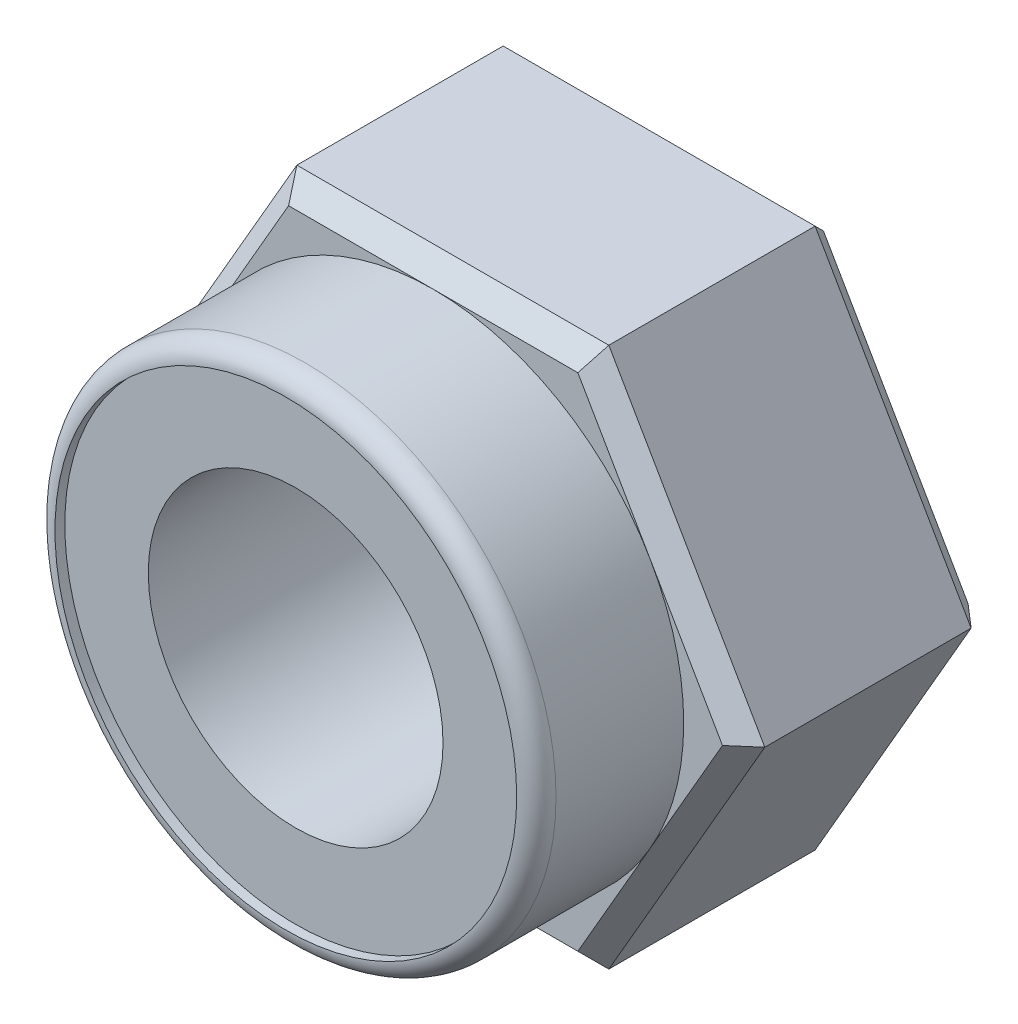
ISO-10303-21;
HEADER;
FILE_DESCRIPTION(('STEP AP214'),'2;1');
FILE_NAME('part.step','',(''),(''),'','','');
FILE_SCHEMA(('AUTOMOTIVE_DESIGN { 1 0 10303 214 1 1 1 1 }'));
ENDSEC;
DATA;
#1=APPLICATION_CONTEXT('core data for automotive mechanical design processes');
#2=APPLICATION_PROTOCOL_DEFINITION('international standard','automotive_design',2000,#1);
#3=PRODUCT_CONTEXT('',#1,'mechanical');
#4=PRODUCT('Part','Part','',(#3));
#5=PRODUCT_RELATED_PRODUCT_CATEGORY('part','',(#4));
#6=PRODUCT_DEFINITION_FORMATION('','',#4);
#7=PRODUCT_DEFINITION_CONTEXT('part definition',#1,'design');
#8=PRODUCT_DEFINITION('design','',#6,#7);
#9=PRODUCT_DEFINITION_SHAPE('','',#8);
#10=(LENGTH_UNIT() NAMED_UNIT(*) SI_UNIT(.MILLI.,.METRE.));
#11=(NAMED_UNIT(*) PLANE_ANGLE_UNIT() SI_UNIT($,.RADIAN.));
#12=(NAMED_UNIT(*) SI_UNIT($,.STERADIAN.) SOLID_ANGLE_UNIT());
#13=UNCERTAINTY_MEASURE_WITH_UNIT(LENGTH_MEASURE(1.E-05),#10,'distance_accuracy_value','');
#14=(GEOMETRIC_REPRESENTATION_CONTEXT(3) GLOBAL_UNCERTAINTY_ASSIGNED_CONTEXT((#13)) GLOBAL_UNIT_ASSIGNED_CONTEXT((#10,
#11,#12)) REPRESENTATION_CONTEXT('',''));
#15=CARTESIAN_POINT('',(0.,0.,0.));
#16=DIRECTION('',(0.,0.,1.));
#17=DIRECTION('',(1.,0.,0.));
#18=AXIS2_PLACEMENT_3D('',#15,#16,#17);
#19=CARTESIAN_POINT('',(0.,0.,2.5));
#20=DIRECTION('',(0.,0.,-1.));
#21=DIRECTION('',(-1.,0.,0.));
#22=AXIS2_PLACEMENT_3D('',#19,#20,#21);
#23=CYLINDRICAL_SURFACE('',#22,1.5);
#24=CARTESIAN_POINT('',(0.,0.,0.));
#25=DIRECTION('',(0.,0.,1.));
#26=DIRECTION('',(1.,0.,0.));
#27=AXIS2_PLACEMENT_3D('',#24,#25,#26);
#28=CIRCLE('',#27,1.5);
#29=CARTESIAN_POINT('',(1.5,0.,0.));
#30=VERTEX_POINT('',#29);
#31=EDGE_CURVE('E178',#30,#30,#28,.T.);
#32=ORIENTED_EDGE('',*,*,#31,.F.);
#33=EDGE_LOOP('',(#32));
#34=FACE_BOUND('',#33,.T.);
#35=CARTESIAN_POINT('',(0.,0.,3.9));
#36=DIRECTION('',(0.,0.,1.));
#37=DIRECTION('',(1.,0.,0.));
#38=AXIS2_PLACEMENT_3D('',#35,#36,#37);
#39=CIRCLE('',#38,1.5);
#40=CARTESIAN_POINT('',(1.5,0.,3.9));
#41=VERTEX_POINT('',#40);
#42=EDGE_CURVE('E393',#41,#41,#39,.T.);
#43=ORIENTED_EDGE('',*,*,#42,.T.);
#44=EDGE_LOOP('',(#43));
#45=FACE_BOUND('',#44,.T.);
#46=ADVANCED_FACE('F36',(#34,#45),#23,.F.);
#47=CARTESIAN_POINT('',(0.,0.,2.5));
#48=DIRECTION('',(0.,0.,1.));
#49=DIRECTION('',(1.,0.,0.));
#50=AXIS2_PLACEMENT_3D('',#47,#48,#49);
#51=PLANE('',#50);
#52=CARTESIAN_POINT('',(0.,0.,2.5));
#53=DIRECTION('',(0.,0.,1.));
#54=DIRECTION('',(1.,0.,0.));
#55=AXIS2_PLACEMENT_3D('',#52,#53,#54);
#56=CIRCLE('',#55,2.55);
#57=CARTESIAN_POINT('',(2.20836477965032,1.275,2.5));
#58=VERTEX_POINT('',#57);
#59=CARTESIAN_POINT('',(0.,2.55,2.5));
#60=VERTEX_POINT('',#59);
#61=EDGE_CURVE('E166',#58,#60,#56,.T.);
#62=ORIENTED_EDGE('',*,*,#61,.F.);
#63=DIRECTION('',(-0.5,0.866025403784439,0.));
#64=VECTOR('',#63,1.);
#65=CARTESIAN_POINT('',(1.41450815951458,2.65,2.5));
#66=LINE('',#65,#64);
#67=CARTESIAN_POINT('',(1.47224318643354,2.55,2.5));
#68=VERTEX_POINT('',#67);
#69=EDGE_CURVE('E153',#58,#68,#66,.T.);
#70=ORIENTED_EDGE('',*,*,#69,.T.);
#71=DIRECTION('',(-1.,0.,0.));
#72=VECTOR('',#71,1.);
#73=CARTESIAN_POINT('',(-1.58771324027147,2.55,2.5));
#74=LINE('',#73,#72);
#75=EDGE_CURVE('E168',#68,#60,#74,.T.);
#76=ORIENTED_EDGE('',*,*,#75,.T.);
#77=EDGE_LOOP('',(#62,#70,#76));
#78=FACE_BOUND('',#77,.T.);
#79=ADVANCED_FACE('F167',(#78),#51,.T.);
#80=CARTESIAN_POINT('',(-2.20836477965032,1.275,2.5));
#81=VERTEX_POINT('',#80);
#82=EDGE_CURVE('E44',#60,#81,#56,.T.);
#83=ORIENTED_EDGE('',*,*,#82,.F.);
#84=CARTESIAN_POINT('',(-1.47224318643355,2.55,2.5));
#85=VERTEX_POINT('',#84);
#86=EDGE_CURVE('E239',#60,#85,#74,.T.);
#87=ORIENTED_EDGE('',*,*,#86,.T.);
#88=DIRECTION('',(-0.5,-0.866025403784439,0.));
#89=VECTOR('',#88,1.);
#90=CARTESIAN_POINT('',(-3.00222139978606,-0.1,2.5));
#91=LINE('',#90,#89);
#92=EDGE_CURVE('E242',#85,#81,#91,.T.);
#93=ORIENTED_EDGE('',*,*,#92,.T.);
#94=EDGE_LOOP('',(#83,#87,#93));
#95=FACE_BOUND('',#94,.T.);
#96=ADVANCED_FACE('F352',(#95),#51,.T.);
#97=CARTESIAN_POINT('',(-2.20836477965032,-1.275,2.5));
#98=VERTEX_POINT('',#97);
#99=EDGE_CURVE('E359',#81,#98,#56,.T.);
#100=ORIENTED_EDGE('',*,*,#99,.F.);
#101=CARTESIAN_POINT('',(-2.94448637286709,0.,2.5));
#102=VERTEX_POINT('',#101);
#103=EDGE_CURVE('E241',#81,#102,#91,.T.);
#104=ORIENTED_EDGE('',*,*,#103,.T.);
#105=DIRECTION('',(0.5,-0.866025403784439,0.));
#106=VECTOR('',#105,1.);
#107=CARTESIAN_POINT('',(-1.41450815951458,-2.65,2.5));
#108=LINE('',#107,#106);
#109=EDGE_CURVE('E246',#102,#98,#108,.T.);
#110=ORIENTED_EDGE('',*,*,#109,.T.);
#111=EDGE_LOOP('',(#100,#104,#110));
#112=FACE_BOUND('',#111,.T.);
#113=ADVANCED_FACE('F357',(#112),#51,.T.);
#114=CARTESIAN_POINT('',(0.,-2.55,2.5));
#115=VERTEX_POINT('',#114);
#116=EDGE_CURVE('E59',#98,#115,#56,.T.);
#117=ORIENTED_EDGE('',*,*,#116,.F.);
#118=CARTESIAN_POINT('',(-1.47224318643355,-2.55,2.5));
#119=VERTEX_POINT('',#118);
#120=EDGE_CURVE('E245',#98,#119,#108,.T.);
#121=ORIENTED_EDGE('',*,*,#120,.T.);
#122=DIRECTION('',(1.,0.,0.));
#123=VECTOR('',#122,1.);
#124=CARTESIAN_POINT('',(1.58771324027147,-2.55,2.5));
#125=LINE('',#124,#123);
#126=EDGE_CURVE('E250',#119,#115,#125,.T.);
#127=ORIENTED_EDGE('',*,*,#126,.T.);
#128=EDGE_LOOP('',(#117,#121,#127));
#129=FACE_BOUND('',#128,.T.);
#130=ADVANCED_FACE('F361',(#129),#51,.T.);
#131=CARTESIAN_POINT('',(2.20836477965032,-1.275,2.5));
#132=VERTEX_POINT('',#131);
#133=EDGE_CURVE('E51',#115,#132,#56,.T.);
#134=ORIENTED_EDGE('',*,*,#133,.F.);
#135=CARTESIAN_POINT('',(1.47224318643354,-2.55,2.5));
#136=VERTEX_POINT('',#135);
#137=EDGE_CURVE('E249',#115,#136,#125,.T.);
#138=ORIENTED_EDGE('',*,*,#137,.T.);
#139=DIRECTION('',(0.5,0.866025403784439,0.));
#140=VECTOR('',#139,1.);
#141=CARTESIAN_POINT('',(3.00222139978605,0.100000000000001,2.5));
#142=LINE('',#141,#140);
#143=EDGE_CURVE('E164',#136,#132,#142,.T.);
#144=ORIENTED_EDGE('',*,*,#143,.T.);
#145=EDGE_LOOP('',(#134,#138,#144));
#146=FACE_BOUND('',#145,.T.);
#147=ADVANCED_FACE('F367',(#146),#51,.T.);
#148=EDGE_CURVE('E148',#132,#58,#56,.T.);
#149=ORIENTED_EDGE('',*,*,#148,.F.);
#150=CARTESIAN_POINT('',(2.94448637286709,0.,2.5));
#151=VERTEX_POINT('',#150);
#152=EDGE_CURVE('E150',#132,#151,#142,.T.);
#153=ORIENTED_EDGE('',*,*,#152,.T.);
#154=EDGE_CURVE('E144',#151,#58,#66,.T.);
#155=ORIENTED_EDGE('',*,*,#154,.T.);
#156=EDGE_LOOP('',(#149,#153,#155));
#157=FACE_BOUND('',#156,.T.);
#158=ADVANCED_FACE('F146',(#157),#51,.T.);
#159=CARTESIAN_POINT('',(0.,0.,0.));
#160=DIRECTION('',(0.,0.,1.));
#161=DIRECTION('',(1.,0.,0.));
#162=AXIS2_PLACEMENT_3D('',#159,#160,#161);
#163=PLANE('',#162);
#164=DIRECTION('',(0.5,-0.866025403784439,0.));
#165=VECTOR('',#164,1.);
#166=CARTESIAN_POINT('',(2.20836477965032,1.275,0.));
#167=LINE('',#166,#165);
#168=CARTESIAN_POINT('',(1.47224318643354,2.55,0.));
#169=VERTEX_POINT('',#168);
#170=CARTESIAN_POINT('',(2.94448637286709,0.,0.));
#171=VERTEX_POINT('',#170);
#172=EDGE_CURVE('E205',#169,#171,#167,.T.);
#173=ORIENTED_EDGE('',*,*,#172,.T.);
#174=DIRECTION('',(-0.5,-0.866025403784439,0.));
#175=VECTOR('',#174,1.);
#176=CARTESIAN_POINT('',(2.20836477965032,-1.275,0.));
#177=LINE('',#176,#175);
#178=CARTESIAN_POINT('',(1.47224318643354,-2.55,0.));
#179=VERTEX_POINT('',#178);
#180=EDGE_CURVE('E215',#171,#179,#177,.T.);
#181=ORIENTED_EDGE('',*,*,#180,.T.);
#182=DIRECTION('',(-1.,0.,0.));
#183=VECTOR('',#182,1.);
#184=CARTESIAN_POINT('',(0.,-2.55,0.));
#185=LINE('',#184,#183);
#186=CARTESIAN_POINT('',(-1.47224318643354,-2.55,0.));
#187=VERTEX_POINT('',#186);
#188=EDGE_CURVE('E213',#179,#187,#185,.T.);
#189=ORIENTED_EDGE('',*,*,#188,.T.);
#190=DIRECTION('',(-0.5,0.866025403784439,0.));
#191=VECTOR('',#190,1.);
#192=CARTESIAN_POINT('',(-2.20836477965032,-1.275,0.));
#193=LINE('',#192,#191);
#194=CARTESIAN_POINT('',(-2.94448637286709,0.,0.));
#195=VERTEX_POINT('',#194);
#196=EDGE_CURVE('E211',#187,#195,#193,.T.);
#197=ORIENTED_EDGE('',*,*,#196,.T.);
#198=DIRECTION('',(0.5,0.866025403784439,0.));
#199=VECTOR('',#198,1.);
#200=CARTESIAN_POINT('',(-2.20836477965032,1.275,0.));
#201=LINE('',#200,#199);
#202=CARTESIAN_POINT('',(-1.47224318643354,2.55,0.));
#203=VERTEX_POINT('',#202);
#204=EDGE_CURVE('E209',#195,#203,#201,.T.);
#205=ORIENTED_EDGE('',*,*,#204,.T.);
#206=DIRECTION('',(1.,0.,0.));
#207=VECTOR('',#206,1.);
#208=CARTESIAN_POINT('',(0.,2.55,0.));
#209=LINE('',#208,#207);
#210=EDGE_CURVE('E207',#203,#169,#209,.T.);
#211=ORIENTED_EDGE('',*,*,#210,.T.);
#212=EDGE_LOOP('',(#173,#181,#189,#197,#205,#211));
#213=FACE_BOUND('',#212,.T.);
#214=ORIENTED_EDGE('',*,*,#31,.T.);
#215=EDGE_LOOP('',(#214));
#216=FACE_BOUND('',#215,.T.);
#217=ADVANCED_FACE('F314',(#213,#216),#163,.F.);
#218=CARTESIAN_POINT('',(-3.17542648054294,0.,2.5));
#219=DIRECTION('',(0.866025403784439,0.5,0.));
#220=DIRECTION('',(-0.5,0.866025403784439,0.));
#221=AXIS2_PLACEMENT_3D('',#218,#219,#220);
#222=PLANE('',#221);
#223=DIRECTION('',(0.,0.,-1.));
#224=VECTOR('',#223,1.);
#225=CARTESIAN_POINT('',(-3.17542648054294,0.,2.5));
#226=LINE('',#225,#224);
#227=CARTESIAN_POINT('',(-3.17542648054294,0.,2.3));
#228=VERTEX_POINT('',#227);
#229=CARTESIAN_POINT('',(-3.17542648054294,0.,0.200000000000002));
#230=VERTEX_POINT('',#229);
#231=EDGE_CURVE('E181',#228,#230,#226,.T.);
#232=ORIENTED_EDGE('',*,*,#231,.T.);
#233=DIRECTION('',(0.5,-0.866025403784439,0.));
#234=VECTOR('',#233,1.);
#235=CARTESIAN_POINT('',(-3.17542648054294,0.,0.200000000000002));
#236=LINE('',#235,#234);
#237=CARTESIAN_POINT('',(-1.58771324027147,-2.75,0.200000000000002));
#238=VERTEX_POINT('',#237);
#239=EDGE_CURVE('E224',#230,#238,#236,.T.);
#240=ORIENTED_EDGE('',*,*,#239,.T.);
#241=DIRECTION('',(0.,0.,-1.));
#242=VECTOR('',#241,1.);
#243=CARTESIAN_POINT('',(-1.58771324027147,-2.75,2.5));
#244=LINE('',#243,#242);
#245=CARTESIAN_POINT('',(-1.58771324027147,-2.75,2.3));
#246=VERTEX_POINT('',#245);
#247=EDGE_CURVE('E197',#246,#238,#244,.T.);
#248=ORIENTED_EDGE('',*,*,#247,.F.);
#249=DIRECTION('',(-0.5,0.866025403784439,0.));
#250=VECTOR('',#249,1.);
#251=CARTESIAN_POINT('',(-3.17542648054294,0.,2.3));
#252=LINE('',#251,#250);
#253=EDGE_CURVE('E222',#246,#228,#252,.T.);
#254=ORIENTED_EDGE('',*,*,#253,.T.);
#255=EDGE_LOOP('',(#232,#240,#248,#254));
#256=FACE_BOUND('',#255,.T.);
#257=ADVANCED_FACE('F296',(#256),#222,.F.);
#258=CARTESIAN_POINT('',(-1.58771324027147,-2.75,2.5));
#259=DIRECTION('',(0.,1.,0.));
#260=DIRECTION('',(0.,0.,1.));
#261=AXIS2_PLACEMENT_3D('',#258,#259,#260);
#262=PLANE('',#261);
#263=ORIENTED_EDGE('',*,*,#247,.T.);
#264=DIRECTION('',(1.,0.,0.));
#265=VECTOR('',#264,1.);
#266=CARTESIAN_POINT('',(-1.58771324027147,-2.75,0.200000000000002));
#267=LINE('',#266,#265);
#268=CARTESIAN_POINT('',(1.58771324027147,-2.75,0.200000000000002));
#269=VERTEX_POINT('',#268);
#270=EDGE_CURVE('E220',#238,#269,#267,.T.);
#271=ORIENTED_EDGE('',*,*,#270,.T.);
#272=DIRECTION('',(0.,0.,-1.));
#273=VECTOR('',#272,1.);
#274=CARTESIAN_POINT('',(1.58771324027147,-2.75,2.5));
#275=LINE('',#274,#273);
#276=CARTESIAN_POINT('',(1.58771324027147,-2.75,2.3));
#277=VERTEX_POINT('',#276);
#278=EDGE_CURVE('E194',#277,#269,#275,.T.);
#279=ORIENTED_EDGE('',*,*,#278,.F.);
#280=DIRECTION('',(-1.,0.,0.));
#281=VECTOR('',#280,1.);
#282=CARTESIAN_POINT('',(-1.58771324027147,-2.75,2.3));
#283=LINE('',#282,#281);
#284=EDGE_CURVE('E218',#277,#246,#283,.T.);
#285=ORIENTED_EDGE('',*,*,#284,.T.);
#286=EDGE_LOOP('',(#263,#271,#279,#285));
#287=FACE_BOUND('',#286,.T.);
#288=ADVANCED_FACE('F323',(#287),#262,.F.);
#289=CARTESIAN_POINT('',(1.58771324027147,-2.75,2.5));
#290=DIRECTION('',(-0.866025403784439,0.5,0.));
#291=DIRECTION('',(-0.5,-0.866025403784439,0.));
#292=AXIS2_PLACEMENT_3D('',#289,#290,#291);
#293=PLANE('',#292);
#294=ORIENTED_EDGE('',*,*,#278,.T.);
#295=DIRECTION('',(0.5,0.866025403784439,0.));
#296=VECTOR('',#295,1.);
#297=CARTESIAN_POINT('',(1.58771324027147,-2.75,0.200000000000002));
#298=LINE('',#297,#296);
#299=CARTESIAN_POINT('',(3.17542648054294,0.,0.200000000000002));
#300=VERTEX_POINT('',#299);
#301=EDGE_CURVE('E202',#269,#300,#298,.T.);
#302=ORIENTED_EDGE('',*,*,#301,.T.);
#303=DIRECTION('',(0.,0.,-1.));
#304=VECTOR('',#303,1.);
#305=CARTESIAN_POINT('',(3.17542648054294,0.,2.5));
#306=LINE('',#305,#304);
#307=CARTESIAN_POINT('',(3.17542648054294,0.,2.3));
#308=VERTEX_POINT('',#307);
#309=EDGE_CURVE('E191',#308,#300,#306,.T.);
#310=ORIENTED_EDGE('',*,*,#309,.F.);
#311=DIRECTION('',(-0.5,-0.866025403784439,0.));
#312=VECTOR('',#311,1.);
#313=CARTESIAN_POINT('',(1.58771324027147,-2.75,2.3));
#314=LINE('',#313,#312);
#315=EDGE_CURVE('E200',#308,#277,#314,.T.);
#316=ORIENTED_EDGE('',*,*,#315,.T.);
#317=EDGE_LOOP('',(#294,#302,#310,#316));
#318=FACE_BOUND('',#317,.T.);
#319=ADVANCED_FACE('F327',(#318),#293,.F.);
#320=CARTESIAN_POINT('',(3.17542648054294,0.,2.5));
#321=DIRECTION('',(-0.866025403784439,-0.5,0.));
#322=DIRECTION('',(0.5,-0.866025403784439,0.));
#323=AXIS2_PLACEMENT_3D('',#320,#321,#322);
#324=PLANE('',#323);
#325=ORIENTED_EDGE('',*,*,#309,.T.);
#326=DIRECTION('',(-0.5,0.866025403784439,0.));
#327=VECTOR('',#326,1.);
#328=CARTESIAN_POINT('',(3.17542648054294,0.,0.200000000000002));
#329=LINE('',#328,#327);
#330=CARTESIAN_POINT('',(1.58771324027147,2.75,0.200000000000002));
#331=VERTEX_POINT('',#330);
#332=EDGE_CURVE('E237',#300,#331,#329,.T.);
#333=ORIENTED_EDGE('',*,*,#332,.T.);
#334=DIRECTION('',(0.,0.,-1.));
#335=VECTOR('',#334,1.);
#336=CARTESIAN_POINT('',(1.58771324027147,2.75,2.5));
#337=LINE('',#336,#335);
#338=CARTESIAN_POINT('',(1.58771324027147,2.75,2.3));
#339=VERTEX_POINT('',#338);
#340=EDGE_CURVE('E188',#339,#331,#337,.T.);
#341=ORIENTED_EDGE('',*,*,#340,.F.);
#342=DIRECTION('',(0.5,-0.866025403784439,0.));
#343=VECTOR('',#342,1.);
#344=CARTESIAN_POINT('',(3.17542648054294,0.,2.3));
#345=LINE('',#344,#343);
#346=EDGE_CURVE('E234',#339,#308,#345,.T.);
#347=ORIENTED_EDGE('',*,*,#346,.T.);
#348=EDGE_LOOP('',(#325,#333,#341,#347));
#349=FACE_BOUND('',#348,.T.);
#350=ADVANCED_FACE('F342',(#349),#324,.F.);
#351=CARTESIAN_POINT('',(1.58771324027147,2.75,2.5));
#352=DIRECTION('',(0.,-1.,0.));
#353=DIRECTION('',(0.,0.,-1.));
#354=AXIS2_PLACEMENT_3D('',#351,#352,#353);
#355=PLANE('',#354);
#356=ORIENTED_EDGE('',*,*,#340,.T.);
#357=DIRECTION('',(-1.,0.,0.));
#358=VECTOR('',#357,1.);
#359=CARTESIAN_POINT('',(1.58771324027147,2.75,0.200000000000002));
#360=LINE('',#359,#358);
#361=CARTESIAN_POINT('',(-1.58771324027147,2.75,0.200000000000002));
#362=VERTEX_POINT('',#361);
#363=EDGE_CURVE('E232',#331,#362,#360,.T.);
#364=ORIENTED_EDGE('',*,*,#363,.T.);
#365=DIRECTION('',(0.,0.,-1.));
#366=VECTOR('',#365,1.);
#367=CARTESIAN_POINT('',(-1.58771324027147,2.75,2.5));
#368=LINE('',#367,#366);
#369=CARTESIAN_POINT('',(-1.58771324027147,2.75,2.3));
#370=VERTEX_POINT('',#369);
#371=EDGE_CURVE('E185',#370,#362,#368,.T.);
#372=ORIENTED_EDGE('',*,*,#371,.F.);
#373=DIRECTION('',(1.,0.,0.));
#374=VECTOR('',#373,1.);
#375=CARTESIAN_POINT('',(1.58771324027147,2.75,2.3));
#376=LINE('',#375,#374);
#377=EDGE_CURVE('E230',#370,#339,#376,.T.);
#378=ORIENTED_EDGE('',*,*,#377,.T.);
#379=EDGE_LOOP('',(#356,#364,#372,#378));
#380=FACE_BOUND('',#379,.T.);
#381=ADVANCED_FACE('F344',(#380),#355,.F.);
#382=CARTESIAN_POINT('',(-1.58771324027147,2.75,2.5));
#383=DIRECTION('',(0.866025403784439,-0.5,0.));
#384=DIRECTION('',(0.5,0.866025403784439,0.));
#385=AXIS2_PLACEMENT_3D('',#382,#383,#384);
#386=PLANE('',#385);
#387=ORIENTED_EDGE('',*,*,#371,.T.);
#388=DIRECTION('',(-0.5,-0.866025403784439,0.));
#389=VECTOR('',#388,1.);
#390=CARTESIAN_POINT('',(-1.58771324027147,2.75,0.200000000000002));
#391=LINE('',#390,#389);
#392=EDGE_CURVE('E228',#362,#230,#391,.T.);
#393=ORIENTED_EDGE('',*,*,#392,.T.);
#394=ORIENTED_EDGE('',*,*,#231,.F.);
#395=DIRECTION('',(0.5,0.866025403784439,0.));
#396=VECTOR('',#395,1.);
#397=CARTESIAN_POINT('',(-1.58771324027147,2.75,2.3));
#398=LINE('',#397,#396);
#399=EDGE_CURVE('E226',#228,#370,#398,.T.);
#400=ORIENTED_EDGE('',*,*,#399,.T.);
#401=EDGE_LOOP('',(#387,#393,#394,#400));
#402=FACE_BOUND('',#401,.T.);
#403=ADVANCED_FACE('F299',(#402),#386,.F.);
#404=CARTESIAN_POINT('',(-1.58771324027147,2.75,0.200000000000002));
#405=DIRECTION('',(0.612372435695793,-0.353553390593273,0.707106781186549));
#406=DIRECTION('',(-0.5,-0.866025403784439,0.));
#407=AXIS2_PLACEMENT_3D('',#404,#405,#406);
#408=PLANE('',#407);
#409=DIRECTION('',(-0.377964473009229,0.654653670707977,0.654653670707976));
#410=VECTOR('',#409,1.);
#411=CARTESIAN_POINT('',(-1.13408088590819,1.96428571428571,-0.585714285714285));
#412=LINE('',#411,#410);
#413=EDGE_CURVE('E264',#203,#362,#412,.T.);
#414=ORIENTED_EDGE('',*,*,#413,.F.);
#415=ORIENTED_EDGE('',*,*,#204,.F.);
#416=DIRECTION('',(-0.755928946018455,0.,0.654653670707976));
#417=VECTOR('',#416,1.);
#418=CARTESIAN_POINT('',(-2.26816177181639,0.,-0.58571428571428));
#419=LINE('',#418,#417);
#420=EDGE_CURVE('E182',#230,#195,#419,.F.);
#421=ORIENTED_EDGE('',*,*,#420,.F.);
#422=ORIENTED_EDGE('',*,*,#392,.F.);
#423=EDGE_LOOP('',(#414,#415,#421,#422));
#424=FACE_BOUND('',#423,.T.);
#425=ADVANCED_FACE('F304',(#424),#408,.F.);
#426=CARTESIAN_POINT('',(-3.17542648054294,0.,0.200000000000002));
#427=DIRECTION('',(0.612372435695794,0.353553390593274,0.707106781186548));
#428=DIRECTION('',(0.5,-0.866025403784439,0.));
#429=AXIS2_PLACEMENT_3D('',#426,#427,#428);
#430=PLANE('',#429);
#431=ORIENTED_EDGE('',*,*,#420,.T.);
#432=ORIENTED_EDGE('',*,*,#196,.F.);
#433=DIRECTION('',(-0.377964473009227,-0.654653670707978,0.654653670707977));
#434=VECTOR('',#433,1.);
#435=CARTESIAN_POINT('',(-1.13408088590819,-1.96428571428571,-0.585714285714285));
#436=LINE('',#435,#434);
#437=EDGE_CURVE('E261',#238,#187,#436,.F.);
#438=ORIENTED_EDGE('',*,*,#437,.F.);
#439=ORIENTED_EDGE('',*,*,#239,.F.);
#440=EDGE_LOOP('',(#431,#432,#438,#439));
#441=FACE_BOUND('',#440,.T.);
#442=ADVANCED_FACE('F319',(#441),#430,.F.);
#443=CARTESIAN_POINT('',(1.58771324027147,2.75,0.200000000000002));
#444=DIRECTION('',(0.,-0.707106781186547,0.707106781186548));
#445=DIRECTION('',(-1.,0.,0.));
#446=AXIS2_PLACEMENT_3D('',#443,#444,#445);
#447=PLANE('',#446);
#448=ORIENTED_EDGE('',*,*,#413,.T.);
#449=ORIENTED_EDGE('',*,*,#363,.F.);
#450=DIRECTION('',(0.377964473009225,0.654653670707979,0.654653670707977));
#451=VECTOR('',#450,1.);
#452=CARTESIAN_POINT('',(1.13408088590819,1.96428571428571,-0.585714285714289));
#453=LINE('',#452,#451);
#454=EDGE_CURVE('E258',#169,#331,#453,.T.);
#455=ORIENTED_EDGE('',*,*,#454,.F.);
#456=ORIENTED_EDGE('',*,*,#210,.F.);
#457=EDGE_LOOP('',(#448,#449,#455,#456));
#458=FACE_BOUND('',#457,.T.);
#459=ADVANCED_FACE('F310',(#458),#447,.F.);
#460=CARTESIAN_POINT('',(-1.58771324027147,-2.75,0.200000000000002));
#461=DIRECTION('',(0.,0.707106781186547,0.707106781186548));
#462=DIRECTION('',(1.,0.,0.));
#463=AXIS2_PLACEMENT_3D('',#460,#461,#462);
#464=PLANE('',#463);
#465=ORIENTED_EDGE('',*,*,#437,.T.);
#466=ORIENTED_EDGE('',*,*,#188,.F.);
#467=DIRECTION('',(0.377964473009227,-0.654653670707978,0.654653670707976));
#468=VECTOR('',#467,1.);
#469=CARTESIAN_POINT('',(1.13408088590819,-1.96428571428571,-0.585714285714283));
#470=LINE('',#469,#468);
#471=EDGE_CURVE('E255',#269,#179,#470,.F.);
#472=ORIENTED_EDGE('',*,*,#471,.F.);
#473=ORIENTED_EDGE('',*,*,#270,.F.);
#474=EDGE_LOOP('',(#465,#466,#472,#473));
#475=FACE_BOUND('',#474,.T.);
#476=ADVANCED_FACE('F333',(#475),#464,.F.);
#477=CARTESIAN_POINT('',(3.17542648054294,0.,0.200000000000002));
#478=DIRECTION('',(-0.612372435695795,-0.353553390593274,0.707106781186547));
#479=DIRECTION('',(-0.5,0.866025403784439,0.));
#480=AXIS2_PLACEMENT_3D('',#477,#478,#479);
#481=PLANE('',#480);
#482=ORIENTED_EDGE('',*,*,#454,.T.);
#483=ORIENTED_EDGE('',*,*,#332,.F.);
#484=DIRECTION('',(-0.755928946018454,0.,-0.654653670707977));
#485=VECTOR('',#484,1.);
#486=CARTESIAN_POINT('',(3.17542648054294,0.,0.200000000000002));
#487=LINE('',#486,#485);
#488=EDGE_CURVE('E253',#171,#300,#487,.F.);
#489=ORIENTED_EDGE('',*,*,#488,.F.);
#490=ORIENTED_EDGE('',*,*,#172,.F.);
#491=EDGE_LOOP('',(#482,#483,#489,#490));
#492=FACE_BOUND('',#491,.T.);
#493=ADVANCED_FACE('F339',(#492),#481,.F.);
#494=CARTESIAN_POINT('',(1.58771324027147,-2.75,0.200000000000002));
#495=DIRECTION('',(-0.612372435695794,0.353553390593273,0.707106781186548));
#496=DIRECTION('',(0.5,0.866025403784439,0.));
#497=AXIS2_PLACEMENT_3D('',#494,#495,#496);
#498=PLANE('',#497);
#499=ORIENTED_EDGE('',*,*,#471,.T.);
#500=ORIENTED_EDGE('',*,*,#180,.F.);
#501=ORIENTED_EDGE('',*,*,#488,.T.);
#502=ORIENTED_EDGE('',*,*,#301,.F.);
#503=EDGE_LOOP('',(#499,#500,#501,#502));
#504=FACE_BOUND('',#503,.T.);
#505=ADVANCED_FACE('F335',(#504),#498,.F.);
#506=CARTESIAN_POINT('',(-2.20836477965032,-1.275,2.5));
#507=DIRECTION('',(-0.612372435695796,-0.353553390593275,0.707106781186546));
#508=DIRECTION('',(-0.5,0.866025403784439,0.));
#509=AXIS2_PLACEMENT_3D('',#506,#507,#508);
#510=PLANE('',#509);
#511=DIRECTION('',(0.755928946018453,0.,0.654653670707979));
#512=VECTOR('',#511,1.);
#513=CARTESIAN_POINT('',(-2.52384546245751,0.,2.86428571428572));
#514=LINE('',#513,#512);
#515=EDGE_CURVE('E278',#228,#102,#514,.T.);
#516=ORIENTED_EDGE('',*,*,#515,.F.);
#517=ORIENTED_EDGE('',*,*,#253,.F.);
#518=DIRECTION('',(0.377964473009226,0.654653670707976,0.654653670707979));
#519=VECTOR('',#518,1.);
#520=CARTESIAN_POINT('',(-1.26192273122875,-2.18571428571429,2.86428571428572));
#521=LINE('',#520,#519);
#522=EDGE_CURVE('E256',#119,#246,#521,.F.);
#523=ORIENTED_EDGE('',*,*,#522,.F.);
#524=ORIENTED_EDGE('',*,*,#120,.F.);
#525=ORIENTED_EDGE('',*,*,#109,.F.);
#526=EDGE_LOOP('',(#516,#517,#523,#524,#525));
#527=FACE_BOUND('',#526,.T.);
#528=ADVANCED_FACE('F290',(#527),#510,.T.);
#529=CARTESIAN_POINT('',(0.,-2.55,2.5));
#530=DIRECTION('',(0.,-0.707106781186549,0.707106781186546));
#531=DIRECTION('',(-1.,0.,0.));
#532=AXIS2_PLACEMENT_3D('',#529,#530,#531);
#533=PLANE('',#532);
#534=ORIENTED_EDGE('',*,*,#522,.T.);
#535=ORIENTED_EDGE('',*,*,#284,.F.);
#536=DIRECTION('',(-0.377964473009228,0.654653670707976,0.654653670707978));
#537=VECTOR('',#536,1.);
#538=CARTESIAN_POINT('',(1.26192273122875,-2.18571428571429,2.86428571428572));
#539=LINE('',#538,#537);
#540=EDGE_CURVE('E275',#136,#277,#539,.F.);
#541=ORIENTED_EDGE('',*,*,#540,.F.);
#542=ORIENTED_EDGE('',*,*,#137,.F.);
#543=ORIENTED_EDGE('',*,*,#126,.F.);
#544=EDGE_LOOP('',(#534,#535,#541,#542,#543));
#545=FACE_BOUND('',#544,.T.);
#546=ADVANCED_FACE('F285',(#545),#533,.T.);
#547=CARTESIAN_POINT('',(-2.20836477965032,1.275,2.5));
#548=DIRECTION('',(-0.612372435695796,0.353553390593275,0.707106781186546));
#549=DIRECTION('',(0.5,0.866025403784439,0.));
#550=AXIS2_PLACEMENT_3D('',#547,#548,#549);
#551=PLANE('',#550);
#552=ORIENTED_EDGE('',*,*,#515,.T.);
#553=ORIENTED_EDGE('',*,*,#103,.F.);
#554=ORIENTED_EDGE('',*,*,#92,.F.);
#555=DIRECTION('',(0.377964473009226,-0.654653670707976,0.654653670707979));
#556=VECTOR('',#555,1.);
#557=CARTESIAN_POINT('',(-1.26192273122876,2.18571428571429,2.86428571428571));
#558=LINE('',#557,#556);
#559=EDGE_CURVE('E272',#370,#85,#558,.T.);
#560=ORIENTED_EDGE('',*,*,#559,.F.);
#561=ORIENTED_EDGE('',*,*,#399,.F.);
#562=EDGE_LOOP('',(#552,#553,#554,#560,#561));
#563=FACE_BOUND('',#562,.T.);
#564=ADVANCED_FACE('F355',(#563),#551,.T.);
#565=CARTESIAN_POINT('',(2.20836477965032,-1.275,2.5));
#566=DIRECTION('',(0.612372435695795,-0.353553390593274,0.707106781186547));
#567=DIRECTION('',(-0.5,-0.866025403784439,0.));
#568=AXIS2_PLACEMENT_3D('',#565,#566,#567);
#569=PLANE('',#568);
#570=ORIENTED_EDGE('',*,*,#540,.T.);
#571=ORIENTED_EDGE('',*,*,#315,.F.);
#572=DIRECTION('',(-0.755928946018453,0.,0.654653670707979));
#573=VECTOR('',#572,1.);
#574=CARTESIAN_POINT('',(2.52384546245751,0.,2.86428571428571));
#575=LINE('',#574,#573);
#576=EDGE_CURVE('E270',#151,#308,#575,.F.);
#577=ORIENTED_EDGE('',*,*,#576,.F.);
#578=ORIENTED_EDGE('',*,*,#152,.F.);
#579=ORIENTED_EDGE('',*,*,#143,.F.);
#580=EDGE_LOOP('',(#570,#571,#577,#578,#579));
#581=FACE_BOUND('',#580,.T.);
#582=ADVANCED_FACE('F486',(#581),#569,.T.);
#583=CARTESIAN_POINT('',(0.,2.55,2.5));
#584=DIRECTION('',(0.,0.707106781186549,0.707106781186546));
#585=DIRECTION('',(1.,0.,0.));
#586=AXIS2_PLACEMENT_3D('',#583,#584,#585);
#587=PLANE('',#586);
#588=ORIENTED_EDGE('',*,*,#559,.T.);
#589=ORIENTED_EDGE('',*,*,#86,.F.);
#590=ORIENTED_EDGE('',*,*,#75,.F.);
#591=DIRECTION('',(0.377964473009225,0.654653670707976,-0.654653670707979));
#592=VECTOR('',#591,1.);
#593=CARTESIAN_POINT('',(1.26192273122875,2.18571428571429,2.86428571428571));
#594=LINE('',#593,#592);
#595=EDGE_CURVE('E160',#339,#68,#594,.F.);
#596=ORIENTED_EDGE('',*,*,#595,.F.);
#597=ORIENTED_EDGE('',*,*,#377,.F.);
#598=EDGE_LOOP('',(#588,#589,#590,#596,#597));
#599=FACE_BOUND('',#598,.T.);
#600=ADVANCED_FACE('F348',(#599),#587,.T.);
#601=CARTESIAN_POINT('',(2.20836477965032,1.275,2.5));
#602=DIRECTION('',(0.612372435695796,0.353553390593275,0.707106781186545));
#603=DIRECTION('',(0.5,-0.866025403784439,0.));
#604=AXIS2_PLACEMENT_3D('',#601,#602,#603);
#605=PLANE('',#604);
#606=ORIENTED_EDGE('',*,*,#576,.T.);
#607=ORIENTED_EDGE('',*,*,#346,.F.);
#608=ORIENTED_EDGE('',*,*,#595,.T.);
#609=ORIENTED_EDGE('',*,*,#69,.F.);
#610=ORIENTED_EDGE('',*,*,#154,.F.);
#611=EDGE_LOOP('',(#606,#607,#608,#609,#610));
#612=FACE_BOUND('',#611,.T.);
#613=ADVANCED_FACE('F157',(#612),#605,.T.);
#614=CARTESIAN_POINT('',(0.,0.,15.2124891681028));
#615=DIRECTION('',(0.,0.,-1.));
#616=DIRECTION('',(-1.,0.,0.));
#617=AXIS2_PLACEMENT_3D('',#614,#615,#616);
#618=CYLINDRICAL_SURFACE('',#617,2.55);
#619=CARTESIAN_POINT('',(0.,0.,3.8));
#620=DIRECTION('',(0.,0.,1.));
#621=DIRECTION('',(1.,0.,0.));
#622=AXIS2_PLACEMENT_3D('',#619,#620,#621);
#623=CIRCLE('',#622,2.55);
#624=CARTESIAN_POINT('',(2.55,0.,3.8));
#625=VERTEX_POINT('',#624);
#626=EDGE_CURVE('E12',#625,#625,#623,.F.);
#627=ORIENTED_EDGE('',*,*,#626,.T.);
#628=EDGE_LOOP('',(#627));
#629=FACE_BOUND('',#628,.T.);
#630=ORIENTED_EDGE('',*,*,#61,.T.);
#631=ORIENTED_EDGE('',*,*,#82,.T.);
#632=ORIENTED_EDGE('',*,*,#99,.T.);
#633=ORIENTED_EDGE('',*,*,#116,.T.);
#634=ORIENTED_EDGE('',*,*,#133,.T.);
#635=ORIENTED_EDGE('',*,*,#148,.T.);
#636=EDGE_LOOP('',(#630,#631,#632,#633,#634,#635));
#637=FACE_BOUND('',#636,.T.);
#638=ADVANCED_FACE('F173',(#629,#637),#618,.T.);
#639=CARTESIAN_POINT('',(0.,0.,3.8));
#640=DIRECTION('',(0.,0.,1.));
#641=DIRECTION('',(1.,0.,0.));
#642=AXIS2_PLACEMENT_3D('',#639,#640,#641);
#643=TOROIDAL_SURFACE('',#642,2.35,0.2);
#644=ORIENTED_EDGE('',*,*,#626,.F.);
#645=EDGE_LOOP('',(#644));
#646=FACE_BOUND('',#645,.T.);
#647=CARTESIAN_POINT('',(0.,0.,4.));
#648=DIRECTION('',(0.,0.,1.));
#649=DIRECTION('',(1.,0.,0.));
#650=AXIS2_PLACEMENT_3D('',#647,#648,#649);
#651=CIRCLE('',#650,2.35);
#652=CARTESIAN_POINT('',(2.35,0.,4.));
#653=VERTEX_POINT('',#652);
#654=EDGE_CURVE('E176',#653,#653,#651,.T.);
#655=ORIENTED_EDGE('',*,*,#654,.F.);
#656=EDGE_LOOP('',(#655));
#657=FACE_BOUND('',#656,.T.);
#658=ADVANCED_FACE('F38',(#646,#657),#643,.T.);
#659=CARTESIAN_POINT('',(0.,0.,3.9));
#660=DIRECTION('',(0.,0.,1.));
#661=DIRECTION('',(1.,0.,0.));
#662=AXIS2_PLACEMENT_3D('',#659,#660,#661);
#663=CYLINDRICAL_SURFACE('',#662,2.35);
#664=CARTESIAN_POINT('',(0.,0.,3.9));
#665=DIRECTION('',(0.,0.,1.));
#666=DIRECTION('',(1.,0.,0.));
#667=AXIS2_PLACEMENT_3D('',#664,#665,#666);
#668=CIRCLE('',#667,2.35);
#669=CARTESIAN_POINT('',(2.35,0.,3.9));
#670=VERTEX_POINT('',#669);
#671=EDGE_CURVE('E171',#670,#670,#668,.T.);
#672=ORIENTED_EDGE('',*,*,#671,.F.);
#673=EDGE_LOOP('',(#672));
#674=FACE_BOUND('',#673,.T.);
#675=ORIENTED_EDGE('',*,*,#654,.T.);
#676=EDGE_LOOP('',(#675));
#677=FACE_BOUND('',#676,.T.);
#678=ADVANCED_FACE('F381',(#674,#677),#663,.F.);
#679=CARTESIAN_POINT('',(0.,0.,3.9));
#680=DIRECTION('',(0.,0.,1.));
#681=DIRECTION('',(1.,0.,0.));
#682=AXIS2_PLACEMENT_3D('',#679,#680,#681);
#683=PLANE('',#682);
#684=ORIENTED_EDGE('',*,*,#42,.F.);
#685=EDGE_LOOP('',(#684));
#686=FACE_BOUND('',#685,.T.);
#687=ORIENTED_EDGE('',*,*,#671,.T.);
#688=EDGE_LOOP('',(#687));
#689=FACE_BOUND('',#688,.T.);
#690=ADVANCED_FACE('F384',(#686,#689),#683,.T.);
#691=CLOSED_SHELL('',(#46,#79,#96,#113,#130,#147,#158,#217,#257,#288,#319,#350,#381,#403,#425,
#442,#459,#476,#493,#505,#528,#546,#564,#582,#600,#613,#638,#658,#678,#690));
#692=MANIFOLD_SOLID_BREP('B2',#691);
#693=ADVANCED_BREP_SHAPE_REPRESENTATION('',(#18,#692),#14);
#694=SHAPE_DEFINITION_REPRESENTATION(#9,#693);
ENDSEC;
END-ISO-10303-21;
